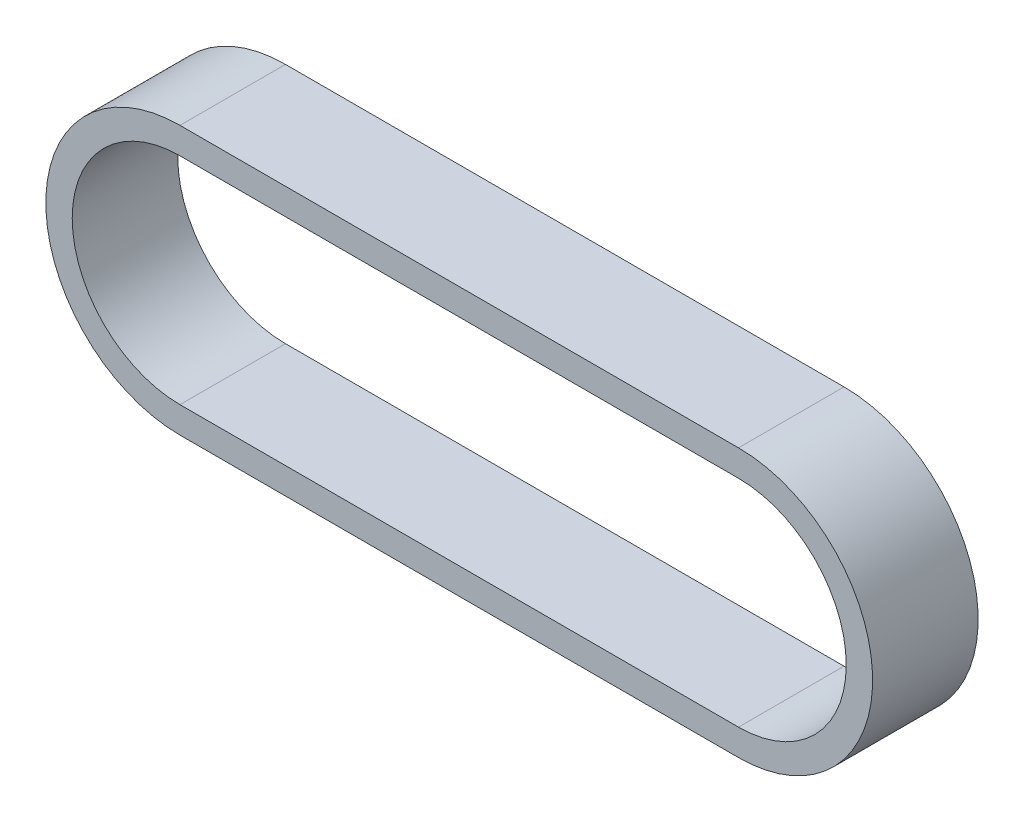
ISO-10303-21;
HEADER;
FILE_DESCRIPTION(('STEP AP214'),'2;1');
FILE_NAME('part.step','',(''),(''),'','','');
FILE_SCHEMA(('AUTOMOTIVE_DESIGN { 1 0 10303 214 1 1 1 1 }'));
ENDSEC;
DATA;
#1=APPLICATION_CONTEXT('core data for automotive mechanical design processes');
#2=APPLICATION_PROTOCOL_DEFINITION('international standard','automotive_design',2000,#1);
#3=PRODUCT_CONTEXT('',#1,'mechanical');
#4=PRODUCT('Part','Part','',(#3));
#5=PRODUCT_RELATED_PRODUCT_CATEGORY('part','',(#4));
#6=PRODUCT_DEFINITION_FORMATION('','',#4);
#7=PRODUCT_DEFINITION_CONTEXT('part definition',#1,'design');
#8=PRODUCT_DEFINITION('design','',#6,#7);
#9=PRODUCT_DEFINITION_SHAPE('','',#8);
#10=(LENGTH_UNIT() NAMED_UNIT(*) SI_UNIT(.MILLI.,.METRE.));
#11=(NAMED_UNIT(*) PLANE_ANGLE_UNIT() SI_UNIT($,.RADIAN.));
#12=(NAMED_UNIT(*) SI_UNIT($,.STERADIAN.) SOLID_ANGLE_UNIT());
#13=UNCERTAINTY_MEASURE_WITH_UNIT(LENGTH_MEASURE(1.E-05),#10,'distance_accuracy_value','');
#14=(GEOMETRIC_REPRESENTATION_CONTEXT(3) GLOBAL_UNCERTAINTY_ASSIGNED_CONTEXT((#13)) GLOBAL_UNIT_ASSIGNED_CONTEXT((#10,
#11,#12)) REPRESENTATION_CONTEXT('',''));
#15=CARTESIAN_POINT('',(0.,0.,0.));
#16=DIRECTION('',(0.,0.,1.));
#17=DIRECTION('',(1.,0.,0.));
#18=AXIS2_PLACEMENT_3D('',#15,#16,#17);
#19=CARTESIAN_POINT('',(0.,0.,6.));
#20=DIRECTION('',(0.,0.,1.));
#21=DIRECTION('',(1.,0.,0.));
#22=AXIS2_PLACEMENT_3D('',#19,#20,#21);
#23=PLANE('',#22);
#24=CARTESIAN_POINT('',(0.,0.,6.));
#25=DIRECTION('',(0.,0.,1.));
#26=DIRECTION('',(1.,0.,0.));
#27=AXIS2_PLACEMENT_3D('',#24,#25,#26);
#28=CIRCLE('',#27,7.62499999999999);
#29=CARTESIAN_POINT('',(0.,7.62499999999999,6.));
#30=VERTEX_POINT('',#29);
#31=CARTESIAN_POINT('',(0.,-7.62499999999999,6.));
#32=VERTEX_POINT('',#31);
#33=EDGE_CURVE('E135',#30,#32,#28,.T.);
#34=ORIENTED_EDGE('',*,*,#33,.T.);
#35=DIRECTION('',(1.,0.,0.));
#36=VECTOR('',#35,1.);
#37=CARTESIAN_POINT('',(0.,-7.62499999999999,6.));
#38=LINE('',#37,#36);
#39=CARTESIAN_POINT('',(31.75,-7.625,6.));
#40=VERTEX_POINT('',#39);
#41=EDGE_CURVE('E138',#32,#40,#38,.T.);
#42=ORIENTED_EDGE('',*,*,#41,.T.);
#43=CARTESIAN_POINT('',(31.75,0.,6.));
#44=DIRECTION('',(0.,0.,1.));
#45=DIRECTION('',(1.,0.,0.));
#46=AXIS2_PLACEMENT_3D('',#43,#44,#45);
#47=CIRCLE('',#46,7.625);
#48=CARTESIAN_POINT('',(31.75,7.625,6.));
#49=VERTEX_POINT('',#48);
#50=EDGE_CURVE('E141',#40,#49,#47,.T.);
#51=ORIENTED_EDGE('',*,*,#50,.T.);
#52=DIRECTION('',(-1.,0.,0.));
#53=VECTOR('',#52,1.);
#54=CARTESIAN_POINT('',(0.,7.62499999999999,6.));
#55=LINE('',#54,#53);
#56=EDGE_CURVE('E143',#49,#30,#55,.T.);
#57=ORIENTED_EDGE('',*,*,#56,.T.);
#58=EDGE_LOOP('',(#34,#42,#51,#57));
#59=FACE_BOUND('',#58,.T.);
#60=DIRECTION('',(1.,0.,0.));
#61=VECTOR('',#60,1.);
#62=CARTESIAN_POINT('',(0.,-6.125,6.));
#63=LINE('',#62,#61);
#64=CARTESIAN_POINT('',(0.,-6.125,6.));
#65=VERTEX_POINT('',#64);
#66=CARTESIAN_POINT('',(31.75,-6.125,6.));
#67=VERTEX_POINT('',#66);
#68=EDGE_CURVE('E107',#65,#67,#63,.T.);
#69=ORIENTED_EDGE('',*,*,#68,.F.);
#70=CARTESIAN_POINT('',(0.,0.,6.));
#71=DIRECTION('',(0.,0.,1.));
#72=DIRECTION('',(1.,0.,0.));
#73=AXIS2_PLACEMENT_3D('',#70,#71,#72);
#74=CIRCLE('',#73,6.125);
#75=CARTESIAN_POINT('',(0.,6.125,6.));
#76=VERTEX_POINT('',#75);
#77=EDGE_CURVE('E99',#76,#65,#74,.T.);
#78=ORIENTED_EDGE('',*,*,#77,.F.);
#79=DIRECTION('',(-1.,0.,0.));
#80=VECTOR('',#79,1.);
#81=CARTESIAN_POINT('',(0.,6.125,6.));
#82=LINE('',#81,#80);
#83=CARTESIAN_POINT('',(31.75,6.125,6.));
#84=VERTEX_POINT('',#83);
#85=EDGE_CURVE('E121',#84,#76,#82,.T.);
#86=ORIENTED_EDGE('',*,*,#85,.F.);
#87=CARTESIAN_POINT('',(31.75,0.,6.));
#88=DIRECTION('',(0.,0.,1.));
#89=DIRECTION('',(1.,0.,0.));
#90=AXIS2_PLACEMENT_3D('',#87,#88,#89);
#91=CIRCLE('',#90,6.125);
#92=EDGE_CURVE('E119',#67,#84,#91,.T.);
#93=ORIENTED_EDGE('',*,*,#92,.F.);
#94=EDGE_LOOP('',(#69,#78,#86,#93));
#95=FACE_BOUND('',#94,.T.);
#96=ADVANCED_FACE('F34',(#59,#95),#23,.T.);
#97=CARTESIAN_POINT('',(0.,0.,0.));
#98=DIRECTION('',(0.,0.,1.));
#99=DIRECTION('',(1.,0.,0.));
#100=AXIS2_PLACEMENT_3D('',#97,#98,#99);
#101=PLANE('',#100);
#102=CARTESIAN_POINT('',(0.,0.,0.));
#103=DIRECTION('',(0.,0.,1.));
#104=DIRECTION('',(1.,0.,0.));
#105=AXIS2_PLACEMENT_3D('',#102,#103,#104);
#106=CIRCLE('',#105,7.62499999999999);
#107=CARTESIAN_POINT('',(0.,7.62499999999999,0.));
#108=VERTEX_POINT('',#107);
#109=CARTESIAN_POINT('',(0.,-7.62499999999999,0.));
#110=VERTEX_POINT('',#109);
#111=EDGE_CURVE('E115',#108,#110,#106,.T.);
#112=ORIENTED_EDGE('',*,*,#111,.F.);
#113=DIRECTION('',(-1.,0.,0.));
#114=VECTOR('',#113,1.);
#115=CARTESIAN_POINT('',(0.,7.62499999999999,0.));
#116=LINE('',#115,#114);
#117=CARTESIAN_POINT('',(31.75,7.625,0.));
#118=VERTEX_POINT('',#117);
#119=EDGE_CURVE('E139',#118,#108,#116,.T.);
#120=ORIENTED_EDGE('',*,*,#119,.F.);
#121=CARTESIAN_POINT('',(31.75,0.,0.));
#122=DIRECTION('',(0.,0.,1.));
#123=DIRECTION('',(1.,0.,0.));
#124=AXIS2_PLACEMENT_3D('',#121,#122,#123);
#125=CIRCLE('',#124,7.625);
#126=CARTESIAN_POINT('',(31.75,-7.625,0.));
#127=VERTEX_POINT('',#126);
#128=EDGE_CURVE('E150',#127,#118,#125,.T.);
#129=ORIENTED_EDGE('',*,*,#128,.F.);
#130=DIRECTION('',(1.,0.,0.));
#131=VECTOR('',#130,1.);
#132=CARTESIAN_POINT('',(0.,-7.62499999999999,0.));
#133=LINE('',#132,#131);
#134=EDGE_CURVE('E148',#110,#127,#133,.T.);
#135=ORIENTED_EDGE('',*,*,#134,.F.);
#136=EDGE_LOOP('',(#112,#120,#129,#135));
#137=FACE_BOUND('',#136,.T.);
#138=CARTESIAN_POINT('',(0.,0.,0.));
#139=DIRECTION('',(0.,0.,1.));
#140=DIRECTION('',(1.,0.,0.));
#141=AXIS2_PLACEMENT_3D('',#138,#139,#140);
#142=CIRCLE('',#141,6.125);
#143=CARTESIAN_POINT('',(0.,6.125,0.));
#144=VERTEX_POINT('',#143);
#145=CARTESIAN_POINT('',(0.,-6.125,0.));
#146=VERTEX_POINT('',#145);
#147=EDGE_CURVE('E57',#144,#146,#142,.T.);
#148=ORIENTED_EDGE('',*,*,#147,.T.);
#149=DIRECTION('',(1.,0.,0.));
#150=VECTOR('',#149,1.);
#151=CARTESIAN_POINT('',(0.,-6.125,0.));
#152=LINE('',#151,#150);
#153=CARTESIAN_POINT('',(31.75,-6.125,0.));
#154=VERTEX_POINT('',#153);
#155=EDGE_CURVE('E114',#146,#154,#152,.T.);
#156=ORIENTED_EDGE('',*,*,#155,.T.);
#157=CARTESIAN_POINT('',(31.75,0.,0.));
#158=DIRECTION('',(0.,0.,1.));
#159=DIRECTION('',(1.,0.,0.));
#160=AXIS2_PLACEMENT_3D('',#157,#158,#159);
#161=CIRCLE('',#160,6.125);
#162=CARTESIAN_POINT('',(31.75,6.125,0.));
#163=VERTEX_POINT('',#162);
#164=EDGE_CURVE('E127',#154,#163,#161,.T.);
#165=ORIENTED_EDGE('',*,*,#164,.T.);
#166=DIRECTION('',(-1.,0.,0.));
#167=VECTOR('',#166,1.);
#168=CARTESIAN_POINT('',(0.,6.125,0.));
#169=LINE('',#168,#167);
#170=EDGE_CURVE('E108',#163,#144,#169,.T.);
#171=ORIENTED_EDGE('',*,*,#170,.T.);
#172=EDGE_LOOP('',(#148,#156,#165,#171));
#173=FACE_BOUND('',#172,.T.);
#174=ADVANCED_FACE('F168',(#137,#173),#101,.F.);
#175=CARTESIAN_POINT('',(0.,0.,6.));
#176=DIRECTION('',(0.,0.,-1.));
#177=DIRECTION('',(-1.,0.,0.));
#178=AXIS2_PLACEMENT_3D('',#175,#176,#177);
#179=CYLINDRICAL_SURFACE('',#178,7.62499999999999);
#180=ORIENTED_EDGE('',*,*,#111,.T.);
#181=DIRECTION('',(0.,0.,-1.));
#182=VECTOR('',#181,1.);
#183=CARTESIAN_POINT('',(0.,-7.62499999999999,6.));
#184=LINE('',#183,#182);
#185=EDGE_CURVE('E11',#32,#110,#184,.T.);
#186=ORIENTED_EDGE('',*,*,#185,.F.);
#187=ORIENTED_EDGE('',*,*,#33,.F.);
#188=DIRECTION('',(0.,0.,-1.));
#189=VECTOR('',#188,1.);
#190=CARTESIAN_POINT('',(0.,7.62499999999999,6.));
#191=LINE('',#190,#189);
#192=EDGE_CURVE('E145',#30,#108,#191,.T.);
#193=ORIENTED_EDGE('',*,*,#192,.T.);
#194=EDGE_LOOP('',(#180,#186,#187,#193));
#195=FACE_BOUND('',#194,.T.);
#196=ADVANCED_FACE('F36',(#195),#179,.T.);
#197=CARTESIAN_POINT('',(0.,-7.62499999999999,6.));
#198=DIRECTION('',(0.,1.,0.));
#199=DIRECTION('',(-1.,0.,0.));
#200=AXIS2_PLACEMENT_3D('',#197,#198,#199);
#201=PLANE('',#200);
#202=ORIENTED_EDGE('',*,*,#134,.T.);
#203=DIRECTION('',(0.,0.,-1.));
#204=VECTOR('',#203,1.);
#205=CARTESIAN_POINT('',(31.75,-7.625,6.));
#206=LINE('',#205,#204);
#207=EDGE_CURVE('E42',#40,#127,#206,.T.);
#208=ORIENTED_EDGE('',*,*,#207,.F.);
#209=ORIENTED_EDGE('',*,*,#41,.F.);
#210=ORIENTED_EDGE('',*,*,#185,.T.);
#211=EDGE_LOOP('',(#202,#208,#209,#210));
#212=FACE_BOUND('',#211,.T.);
#213=ADVANCED_FACE('F178',(#212),#201,.F.);
#214=CARTESIAN_POINT('',(31.75,0.,6.));
#215=DIRECTION('',(0.,0.,-1.));
#216=DIRECTION('',(-1.,0.,0.));
#217=AXIS2_PLACEMENT_3D('',#214,#215,#216);
#218=CYLINDRICAL_SURFACE('',#217,7.625);
#219=ORIENTED_EDGE('',*,*,#128,.T.);
#220=DIRECTION('',(0.,0.,-1.));
#221=VECTOR('',#220,1.);
#222=CARTESIAN_POINT('',(31.75,7.625,6.));
#223=LINE('',#222,#221);
#224=EDGE_CURVE('E155',#49,#118,#223,.T.);
#225=ORIENTED_EDGE('',*,*,#224,.F.);
#226=ORIENTED_EDGE('',*,*,#50,.F.);
#227=ORIENTED_EDGE('',*,*,#207,.T.);
#228=EDGE_LOOP('',(#219,#225,#226,#227));
#229=FACE_BOUND('',#228,.T.);
#230=ADVANCED_FACE('F162',(#229),#218,.T.);
#231=CARTESIAN_POINT('',(0.,7.62499999999999,6.));
#232=DIRECTION('',(0.,-1.,0.));
#233=DIRECTION('',(1.,0.,0.));
#234=AXIS2_PLACEMENT_3D('',#231,#232,#233);
#235=PLANE('',#234);
#236=ORIENTED_EDGE('',*,*,#119,.T.);
#237=ORIENTED_EDGE('',*,*,#192,.F.);
#238=ORIENTED_EDGE('',*,*,#56,.F.);
#239=ORIENTED_EDGE('',*,*,#224,.T.);
#240=EDGE_LOOP('',(#236,#237,#238,#239));
#241=FACE_BOUND('',#240,.T.);
#242=ADVANCED_FACE('F172',(#241),#235,.F.);
#243=CARTESIAN_POINT('',(0.,0.,6.));
#244=DIRECTION('',(0.,0.,-1.));
#245=DIRECTION('',(-1.,0.,0.));
#246=AXIS2_PLACEMENT_3D('',#243,#244,#245);
#247=CYLINDRICAL_SURFACE('',#246,6.125);
#248=ORIENTED_EDGE('',*,*,#147,.F.);
#249=DIRECTION('',(0.,0.,-1.));
#250=VECTOR('',#249,1.);
#251=CARTESIAN_POINT('',(0.,6.125,6.));
#252=LINE('',#251,#250);
#253=EDGE_CURVE('E103',#76,#144,#252,.T.);
#254=ORIENTED_EDGE('',*,*,#253,.F.);
#255=ORIENTED_EDGE('',*,*,#77,.T.);
#256=DIRECTION('',(0.,0.,-1.));
#257=VECTOR('',#256,1.);
#258=CARTESIAN_POINT('',(0.,-6.125,6.));
#259=LINE('',#258,#257);
#260=EDGE_CURVE('E102',#65,#146,#259,.T.);
#261=ORIENTED_EDGE('',*,*,#260,.T.);
#262=EDGE_LOOP('',(#248,#254,#255,#261));
#263=FACE_BOUND('',#262,.T.);
#264=ADVANCED_FACE('F101',(#263),#247,.F.);
#265=CARTESIAN_POINT('',(0.,-6.125,6.));
#266=DIRECTION('',(0.,1.,0.));
#267=DIRECTION('',(0.,0.,1.));
#268=AXIS2_PLACEMENT_3D('',#265,#266,#267);
#269=PLANE('',#268);
#270=ORIENTED_EDGE('',*,*,#155,.F.);
#271=ORIENTED_EDGE('',*,*,#260,.F.);
#272=ORIENTED_EDGE('',*,*,#68,.T.);
#273=DIRECTION('',(0.,0.,-1.));
#274=VECTOR('',#273,1.);
#275=CARTESIAN_POINT('',(31.75,-6.125,6.));
#276=LINE('',#275,#274);
#277=EDGE_CURVE('E116',#67,#154,#276,.T.);
#278=ORIENTED_EDGE('',*,*,#277,.T.);
#279=EDGE_LOOP('',(#270,#271,#272,#278));
#280=FACE_BOUND('',#279,.T.);
#281=ADVANCED_FACE('F111',(#280),#269,.T.);
#282=CARTESIAN_POINT('',(31.75,0.,6.));
#283=DIRECTION('',(0.,0.,-1.));
#284=DIRECTION('',(-1.,0.,0.));
#285=AXIS2_PLACEMENT_3D('',#282,#283,#284);
#286=CYLINDRICAL_SURFACE('',#285,6.125);
#287=ORIENTED_EDGE('',*,*,#164,.F.);
#288=ORIENTED_EDGE('',*,*,#277,.F.);
#289=ORIENTED_EDGE('',*,*,#92,.T.);
#290=DIRECTION('',(0.,0.,-1.));
#291=VECTOR('',#290,1.);
#292=CARTESIAN_POINT('',(31.75,6.125,6.));
#293=LINE('',#292,#291);
#294=EDGE_CURVE('E49',#84,#163,#293,.T.);
#295=ORIENTED_EDGE('',*,*,#294,.T.);
#296=EDGE_LOOP('',(#287,#288,#289,#295));
#297=FACE_BOUND('',#296,.T.);
#298=ADVANCED_FACE('F201',(#297),#286,.F.);
#299=CARTESIAN_POINT('',(0.,6.125,6.));
#300=DIRECTION('',(0.,-1.,0.));
#301=DIRECTION('',(0.,0.,-1.));
#302=AXIS2_PLACEMENT_3D('',#299,#300,#301);
#303=PLANE('',#302);
#304=ORIENTED_EDGE('',*,*,#170,.F.);
#305=ORIENTED_EDGE('',*,*,#294,.F.);
#306=ORIENTED_EDGE('',*,*,#85,.T.);
#307=ORIENTED_EDGE('',*,*,#253,.T.);
#308=EDGE_LOOP('',(#304,#305,#306,#307));
#309=FACE_BOUND('',#308,.T.);
#310=ADVANCED_FACE('F205',(#309),#303,.T.);
#311=CLOSED_SHELL('',(#96,#174,#196,#213,#230,#242,#264,#281,#298,#310));
#312=MANIFOLD_SOLID_BREP('B2',#311);
#313=ADVANCED_BREP_SHAPE_REPRESENTATION('',(#18,#312),#14);
#314=SHAPE_DEFINITION_REPRESENTATION(#9,#313);
ENDSEC;
END-ISO-10303-21;
